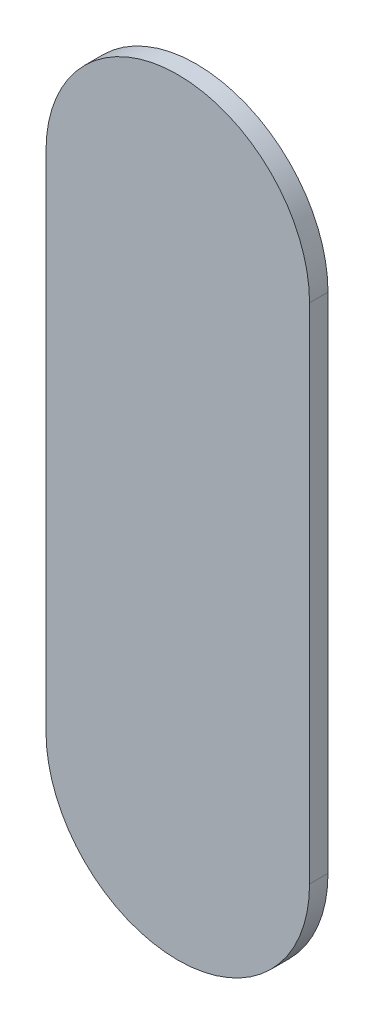
ISO-10303-21;
HEADER;
FILE_DESCRIPTION(('STEP AP214'),'2;1');
FILE_NAME('part.step','',(''),(''),'','','');
FILE_SCHEMA(('AUTOMOTIVE_DESIGN { 1 0 10303 214 1 1 1 1 }'));
ENDSEC;
DATA;
#1=APPLICATION_CONTEXT('core data for automotive mechanical design processes');
#2=APPLICATION_PROTOCOL_DEFINITION('international standard','automotive_design',2000,#1);
#3=PRODUCT_CONTEXT('',#1,'mechanical');
#4=PRODUCT('Part','Part','',(#3));
#5=PRODUCT_RELATED_PRODUCT_CATEGORY('part','',(#4));
#6=PRODUCT_DEFINITION_FORMATION('','',#4);
#7=PRODUCT_DEFINITION_CONTEXT('part definition',#1,'design');
#8=PRODUCT_DEFINITION('design','',#6,#7);
#9=PRODUCT_DEFINITION_SHAPE('','',#8);
#10=(LENGTH_UNIT() NAMED_UNIT(*) SI_UNIT(.MILLI.,.METRE.));
#11=(NAMED_UNIT(*) PLANE_ANGLE_UNIT() SI_UNIT($,.RADIAN.));
#12=(NAMED_UNIT(*) SI_UNIT($,.STERADIAN.) SOLID_ANGLE_UNIT());
#13=UNCERTAINTY_MEASURE_WITH_UNIT(LENGTH_MEASURE(1.E-05),#10,'distance_accuracy_value','');
#14=(GEOMETRIC_REPRESENTATION_CONTEXT(3) GLOBAL_UNCERTAINTY_ASSIGNED_CONTEXT((#13)) GLOBAL_UNIT_ASSIGNED_CONTEXT((#10,
#11,#12)) REPRESENTATION_CONTEXT('',''));
#15=CARTESIAN_POINT('',(0.,0.,0.));
#16=DIRECTION('',(0.,0.,1.));
#17=DIRECTION('',(1.,0.,0.));
#18=AXIS2_PLACEMENT_3D('',#15,#16,#17);
#19=CARTESIAN_POINT('',(150.852,-112.377,1.635));
#20=DIRECTION('',(0.,0.,1.));
#21=DIRECTION('',(1.,0.,0.));
#22=AXIS2_PLACEMENT_3D('',#19,#20,#21);
#23=PLANE('',#22);
#24=DIRECTION('',(0.,1.,0.));
#25=VECTOR('',#24,1.);
#26=CARTESIAN_POINT('',(150.852,-112.377,1.635));
#27=LINE('',#26,#25);
#28=CARTESIAN_POINT('',(150.852,-112.377,1.635));
#29=VERTEX_POINT('',#28);
#30=CARTESIAN_POINT('',(150.852,-111.422,1.635));
#31=VERTEX_POINT('',#30);
#32=EDGE_CURVE('E99',#29,#31,#27,.T.);
#33=ORIENTED_EDGE('',*,*,#32,.T.);
#34=CARTESIAN_POINT('',(150.602,-111.422,1.635));
#35=DIRECTION('',(0.,0.,1.));
#36=DIRECTION('',(1.,0.,0.));
#37=AXIS2_PLACEMENT_3D('',#34,#35,#36);
#38=CIRCLE('',#37,0.25);
#39=CARTESIAN_POINT('',(150.352,-111.422,1.635));
#40=VERTEX_POINT('',#39);
#41=EDGE_CURVE('E78',#31,#40,#38,.T.);
#42=ORIENTED_EDGE('',*,*,#41,.T.);
#43=DIRECTION('',(0.,-1.,0.));
#44=VECTOR('',#43,1.);
#45=CARTESIAN_POINT('',(150.352,-111.422,1.635));
#46=LINE('',#45,#44);
#47=CARTESIAN_POINT('',(150.352,-112.377,1.635));
#48=VERTEX_POINT('',#47);
#49=EDGE_CURVE('E83',#40,#48,#46,.T.);
#50=ORIENTED_EDGE('',*,*,#49,.T.);
#51=CARTESIAN_POINT('',(150.602,-112.377,1.635));
#52=DIRECTION('',(0.,0.,1.));
#53=DIRECTION('',(-1.,0.,0.));
#54=AXIS2_PLACEMENT_3D('',#51,#52,#53);
#55=CIRCLE('',#54,0.25);
#56=EDGE_CURVE('E11',#48,#29,#55,.T.);
#57=ORIENTED_EDGE('',*,*,#56,.T.);
#58=EDGE_LOOP('',(#33,#42,#50,#57));
#59=FACE_BOUND('',#58,.T.);
#60=ADVANCED_FACE('F17',(#59),#23,.T.);
#61=CARTESIAN_POINT('',(150.852,-112.377,1.6));
#62=DIRECTION('',(0.,0.,1.));
#63=DIRECTION('',(1.,0.,0.));
#64=AXIS2_PLACEMENT_3D('',#61,#62,#63);
#65=PLANE('',#64);
#66=CARTESIAN_POINT('',(150.602,-112.377,1.6));
#67=DIRECTION('',(0.,0.,1.));
#68=DIRECTION('',(-1.,0.,0.));
#69=AXIS2_PLACEMENT_3D('',#66,#67,#68);
#70=CIRCLE('',#69,0.25);
#71=CARTESIAN_POINT('',(150.352,-112.377,1.6));
#72=VERTEX_POINT('',#71);
#73=CARTESIAN_POINT('',(150.852,-112.377,1.6));
#74=VERTEX_POINT('',#73);
#75=EDGE_CURVE('E20',#72,#74,#70,.T.);
#76=ORIENTED_EDGE('',*,*,#75,.F.);
#77=DIRECTION('',(0.,-1.,0.));
#78=VECTOR('',#77,1.);
#79=CARTESIAN_POINT('',(150.352,-111.422,1.6));
#80=LINE('',#79,#78);
#81=CARTESIAN_POINT('',(150.352,-111.422,1.6));
#82=VERTEX_POINT('',#81);
#83=EDGE_CURVE('E68',#82,#72,#80,.T.);
#84=ORIENTED_EDGE('',*,*,#83,.F.);
#85=CARTESIAN_POINT('',(150.602,-111.422,1.6));
#86=DIRECTION('',(0.,0.,1.));
#87=DIRECTION('',(1.,0.,0.));
#88=AXIS2_PLACEMENT_3D('',#85,#86,#87);
#89=CIRCLE('',#88,0.25);
#90=CARTESIAN_POINT('',(150.852,-111.422,1.6));
#91=VERTEX_POINT('',#90);
#92=EDGE_CURVE('E72',#91,#82,#89,.T.);
#93=ORIENTED_EDGE('',*,*,#92,.F.);
#94=DIRECTION('',(0.,1.,0.));
#95=VECTOR('',#94,1.);
#96=CARTESIAN_POINT('',(150.852,-112.377,1.6));
#97=LINE('',#96,#95);
#98=EDGE_CURVE('E113',#74,#91,#97,.T.);
#99=ORIENTED_EDGE('',*,*,#98,.F.);
#100=EDGE_LOOP('',(#76,#84,#93,#99));
#101=FACE_BOUND('',#100,.T.);
#102=ADVANCED_FACE('F70',(#101),#65,.F.);
#103=CARTESIAN_POINT('',(150.602,-112.377,1.6));
#104=DIRECTION('',(0.,0.,-1.));
#105=DIRECTION('',(-1.,0.,0.));
#106=AXIS2_PLACEMENT_3D('',#103,#104,#105);
#107=CYLINDRICAL_SURFACE('',#106,0.25);
#108=ORIENTED_EDGE('',*,*,#75,.T.);
#109=DIRECTION('',(0.,0.,1.));
#110=VECTOR('',#109,1.);
#111=CARTESIAN_POINT('',(150.852,-112.377,1.6));
#112=LINE('',#111,#110);
#113=EDGE_CURVE('E93',#74,#29,#112,.T.);
#114=ORIENTED_EDGE('',*,*,#113,.T.);
#115=ORIENTED_EDGE('',*,*,#56,.F.);
#116=DIRECTION('',(0.,0.,1.));
#117=VECTOR('',#116,1.);
#118=CARTESIAN_POINT('',(150.352,-112.377,1.6));
#119=LINE('',#118,#117);
#120=EDGE_CURVE('E77',#72,#48,#119,.T.);
#121=ORIENTED_EDGE('',*,*,#120,.F.);
#122=EDGE_LOOP('',(#108,#114,#115,#121));
#123=FACE_BOUND('',#122,.T.);
#124=ADVANCED_FACE('F126',(#123),#107,.T.);
#125=CARTESIAN_POINT('',(150.352,-111.422,1.6));
#126=DIRECTION('',(1.,0.,0.));
#127=DIRECTION('',(0.,1.,0.));
#128=AXIS2_PLACEMENT_3D('',#125,#126,#127);
#129=PLANE('',#128);
#130=ORIENTED_EDGE('',*,*,#83,.T.);
#131=ORIENTED_EDGE('',*,*,#120,.T.);
#132=ORIENTED_EDGE('',*,*,#49,.F.);
#133=DIRECTION('',(0.,0.,1.));
#134=VECTOR('',#133,1.);
#135=CARTESIAN_POINT('',(150.352,-111.422,1.6));
#136=LINE('',#135,#134);
#137=EDGE_CURVE('E81',#82,#40,#136,.T.);
#138=ORIENTED_EDGE('',*,*,#137,.F.);
#139=EDGE_LOOP('',(#130,#131,#132,#138));
#140=FACE_BOUND('',#139,.T.);
#141=ADVANCED_FACE('F82',(#140),#129,.F.);
#142=CARTESIAN_POINT('',(150.602,-111.422,1.6));
#143=DIRECTION('',(0.,0.,-1.));
#144=DIRECTION('',(1.,0.,0.));
#145=AXIS2_PLACEMENT_3D('',#142,#143,#144);
#146=CYLINDRICAL_SURFACE('',#145,0.25);
#147=ORIENTED_EDGE('',*,*,#92,.T.);
#148=ORIENTED_EDGE('',*,*,#137,.T.);
#149=ORIENTED_EDGE('',*,*,#41,.F.);
#150=DIRECTION('',(0.,0.,1.));
#151=VECTOR('',#150,1.);
#152=CARTESIAN_POINT('',(150.852,-111.422,1.6));
#153=LINE('',#152,#151);
#154=EDGE_CURVE('E90',#91,#31,#153,.T.);
#155=ORIENTED_EDGE('',*,*,#154,.F.);
#156=EDGE_LOOP('',(#147,#148,#149,#155));
#157=FACE_BOUND('',#156,.T.);
#158=ADVANCED_FACE('F88',(#157),#146,.T.);
#159=CARTESIAN_POINT('',(150.852,-112.377,1.6));
#160=DIRECTION('',(-1.,0.,0.));
#161=DIRECTION('',(0.,0.,1.));
#162=AXIS2_PLACEMENT_3D('',#159,#160,#161);
#163=PLANE('',#162);
#164=ORIENTED_EDGE('',*,*,#98,.T.);
#165=ORIENTED_EDGE('',*,*,#154,.T.);
#166=ORIENTED_EDGE('',*,*,#32,.F.);
#167=ORIENTED_EDGE('',*,*,#113,.F.);
#168=EDGE_LOOP('',(#164,#165,#166,#167));
#169=FACE_BOUND('',#168,.T.);
#170=ADVANCED_FACE('F125',(#169),#163,.F.);
#171=CLOSED_SHELL('',(#60,#102,#124,#141,#158,#170));
#172=MANIFOLD_SOLID_BREP('B1',#171);
#173=ADVANCED_BREP_SHAPE_REPRESENTATION('',(#18,#172),#14);
#174=SHAPE_DEFINITION_REPRESENTATION(#9,#173);
ENDSEC;
END-ISO-10303-21;
